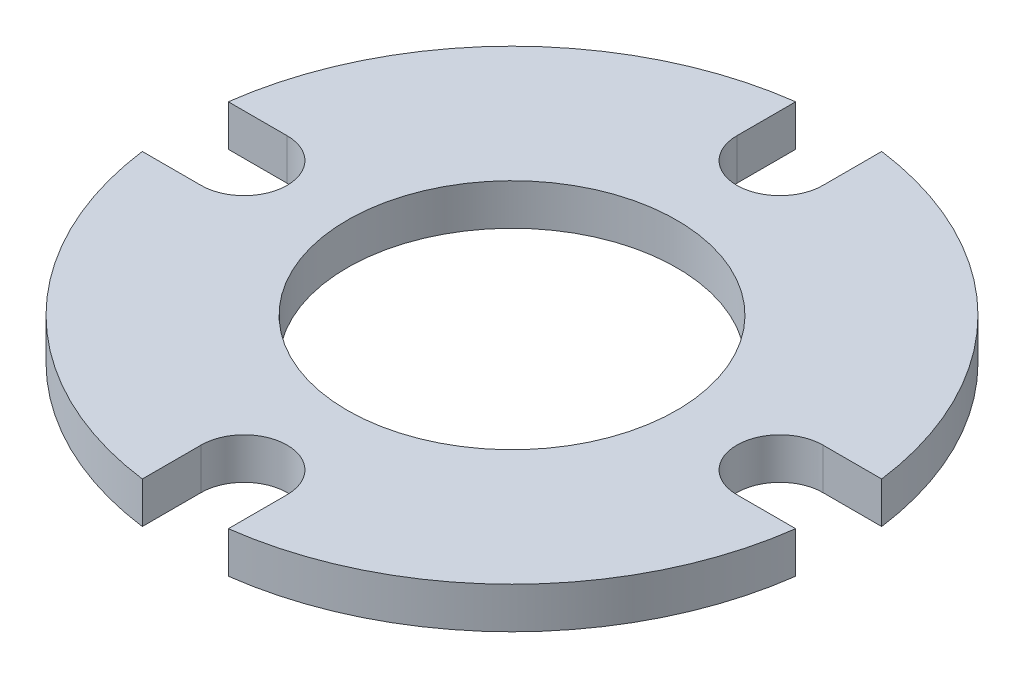
ISO-10303-21;
HEADER;
FILE_DESCRIPTION(('STEP AP214'),'2;1');
FILE_NAME('part.step','',(''),(''),'','','');
FILE_SCHEMA(('AUTOMOTIVE_DESIGN { 1 0 10303 214 1 1 1 1 }'));
ENDSEC;
DATA;
#1=APPLICATION_CONTEXT('core data for automotive mechanical design processes');
#2=APPLICATION_PROTOCOL_DEFINITION('international standard','automotive_design',2000,#1);
#3=PRODUCT_CONTEXT('',#1,'mechanical');
#4=PRODUCT('Part','Part','',(#3));
#5=PRODUCT_RELATED_PRODUCT_CATEGORY('part','',(#4));
#6=PRODUCT_DEFINITION_FORMATION('','',#4);
#7=PRODUCT_DEFINITION_CONTEXT('part definition',#1,'design');
#8=PRODUCT_DEFINITION('design','',#6,#7);
#9=PRODUCT_DEFINITION_SHAPE('','',#8);
#10=(LENGTH_UNIT() NAMED_UNIT(*) SI_UNIT(.MILLI.,.METRE.));
#11=(NAMED_UNIT(*) PLANE_ANGLE_UNIT() SI_UNIT($,.RADIAN.));
#12=(NAMED_UNIT(*) SI_UNIT($,.STERADIAN.) SOLID_ANGLE_UNIT());
#13=UNCERTAINTY_MEASURE_WITH_UNIT(LENGTH_MEASURE(1.E-05),#10,'distance_accuracy_value','');
#14=(GEOMETRIC_REPRESENTATION_CONTEXT(3) GLOBAL_UNCERTAINTY_ASSIGNED_CONTEXT((#13)) GLOBAL_UNIT_ASSIGNED_CONTEXT((#10,
#11,#12)) REPRESENTATION_CONTEXT('',''));
#15=CARTESIAN_POINT('',(0.,0.,0.));
#16=DIRECTION('',(0.,0.,1.));
#17=DIRECTION('',(1.,0.,0.));
#18=AXIS2_PLACEMENT_3D('',#15,#16,#17);
#19=CARTESIAN_POINT('',(0.,0.125,0.));
#20=DIRECTION('',(0.,1.,0.));
#21=DIRECTION('',(0.,0.,1.));
#22=AXIS2_PLACEMENT_3D('',#19,#20,#21);
#23=PLANE('',#22);
#24=CARTESIAN_POINT('',(0.,0.125,0.));
#25=DIRECTION('',(0.,1.,0.));
#26=DIRECTION('',(0.,0.,1.));
#27=AXIS2_PLACEMENT_3D('',#24,#25,#26);
#28=CIRCLE('',#27,0.5);
#29=CARTESIAN_POINT('',(0.,0.125,0.5));
#30=VERTEX_POINT('',#29);
#31=EDGE_CURVE('E314',#30,#30,#28,.T.);
#32=ORIENTED_EDGE('',*,*,#31,.F.);
#33=EDGE_LOOP('',(#32));
#34=FACE_BOUND('',#33,.T.);
#35=CARTESIAN_POINT('',(-0.813,0.125,0.));
#36=DIRECTION('',(0.,1.,0.));
#37=DIRECTION('',(1.,0.,0.));
#38=AXIS2_PLACEMENT_3D('',#35,#36,#37);
#39=CIRCLE('',#38,0.130555483320571);
#40=CARTESIAN_POINT('',(-0.813,0.125,-0.130555483320568));
#41=VERTEX_POINT('',#40);
#42=CARTESIAN_POINT('',(-0.813,0.125,0.130555483320574));
#43=VERTEX_POINT('',#42);
#44=EDGE_CURVE('E326',#41,#43,#39,.F.);
#45=ORIENTED_EDGE('',*,*,#44,.T.);
#46=DIRECTION('',(-1.,0.,0.));
#47=VECTOR('',#46,1.);
#48=CARTESIAN_POINT('',(0.,0.125,0.130555483320571));
#49=LINE('',#48,#47);
#50=CARTESIAN_POINT('',(-0.991441004687082,0.125,0.130555483320575));
#51=VERTEX_POINT('',#50);
#52=EDGE_CURVE('E335',#43,#51,#49,.T.);
#53=ORIENTED_EDGE('',*,*,#52,.T.);
#54=CARTESIAN_POINT('',(0.,0.125,0.));
#55=DIRECTION('',(0.,1.,0.));
#56=DIRECTION('',(0.,0.,1.));
#57=AXIS2_PLACEMENT_3D('',#54,#55,#56);
#58=CIRCLE('',#57,1.);
#59=CARTESIAN_POINT('',(-0.130555483320571,0.125,0.991441004687083));
#60=VERTEX_POINT('',#59);
#61=EDGE_CURVE('E211',#51,#60,#58,.T.);
#62=ORIENTED_EDGE('',*,*,#61,.T.);
#63=DIRECTION('',(0.,0.,-1.));
#64=VECTOR('',#63,1.);
#65=CARTESIAN_POINT('',(-0.130555483320571,0.125,0.));
#66=LINE('',#65,#64);
#67=CARTESIAN_POINT('',(-0.130555483320571,0.125,0.813));
#68=VERTEX_POINT('',#67);
#69=EDGE_CURVE('E63',#60,#68,#66,.T.);
#70=ORIENTED_EDGE('',*,*,#69,.T.);
#71=CARTESIAN_POINT('',(0.,0.125,0.813));
#72=DIRECTION('',(0.,1.,0.));
#73=DIRECTION('',(0.,0.,-1.));
#74=AXIS2_PLACEMENT_3D('',#71,#72,#73);
#75=CIRCLE('',#74,0.130555483320571);
#76=CARTESIAN_POINT('',(0.130555483320571,0.125,0.813));
#77=VERTEX_POINT('',#76);
#78=EDGE_CURVE('E356',#68,#77,#75,.F.);
#79=ORIENTED_EDGE('',*,*,#78,.T.);
#80=DIRECTION('',(0.,0.,1.));
#81=VECTOR('',#80,1.);
#82=CARTESIAN_POINT('',(0.130555483320571,0.125,0.));
#83=LINE('',#82,#81);
#84=CARTESIAN_POINT('',(0.130555483320571,0.125,0.991441004687083));
#85=VERTEX_POINT('',#84);
#86=EDGE_CURVE('E226',#77,#85,#83,.T.);
#87=ORIENTED_EDGE('',*,*,#86,.T.);
#88=CARTESIAN_POINT('',(0.991441004687084,0.125,0.130555483320561));
#89=VERTEX_POINT('',#88);
#90=EDGE_CURVE('E185',#85,#89,#58,.T.);
#91=ORIENTED_EDGE('',*,*,#90,.T.);
#92=DIRECTION('',(-1.,0.,0.));
#93=VECTOR('',#92,1.);
#94=CARTESIAN_POINT('',(0.,0.125,0.130555483320571));
#95=LINE('',#94,#93);
#96=CARTESIAN_POINT('',(0.813000000000001,0.125,0.130555483320563));
#97=VERTEX_POINT('',#96);
#98=EDGE_CURVE('E55',#89,#97,#95,.T.);
#99=ORIENTED_EDGE('',*,*,#98,.T.);
#100=CARTESIAN_POINT('',(0.813,0.125,0.));
#101=DIRECTION('',(0.,1.,0.));
#102=DIRECTION('',(-1.,0.,0.));
#103=AXIS2_PLACEMENT_3D('',#100,#101,#102);
#104=CIRCLE('',#103,0.130555483320571);
#105=CARTESIAN_POINT('',(0.812999999999999,0.125,-0.13055548332058));
#106=VERTEX_POINT('',#105);
#107=EDGE_CURVE('E248',#97,#106,#104,.F.);
#108=ORIENTED_EDGE('',*,*,#107,.T.);
#109=DIRECTION('',(1.,0.,0.));
#110=VECTOR('',#109,1.);
#111=CARTESIAN_POINT('',(0.,0.125,-0.130555483320571));
#112=LINE('',#111,#110);
#113=CARTESIAN_POINT('',(0.991441004687082,0.125,-0.130555483320582));
#114=VERTEX_POINT('',#113);
#115=EDGE_CURVE('E258',#106,#114,#112,.T.);
#116=ORIENTED_EDGE('',*,*,#115,.T.);
#117=CARTESIAN_POINT('',(0.130555483320571,0.125,-0.991441004687083));
#118=VERTEX_POINT('',#117);
#119=EDGE_CURVE('E179',#114,#118,#58,.T.);
#120=ORIENTED_EDGE('',*,*,#119,.T.);
#121=DIRECTION('',(0.,0.,1.));
#122=VECTOR('',#121,1.);
#123=CARTESIAN_POINT('',(0.130555483320571,0.125,0.));
#124=LINE('',#123,#122);
#125=CARTESIAN_POINT('',(0.130555483320571,0.125,-0.813));
#126=VERTEX_POINT('',#125);
#127=EDGE_CURVE('E206',#118,#126,#124,.T.);
#128=ORIENTED_EDGE('',*,*,#127,.T.);
#129=CARTESIAN_POINT('',(0.,0.125,-0.813));
#130=DIRECTION('',(0.,1.,0.));
#131=DIRECTION('',(0.,0.,1.));
#132=AXIS2_PLACEMENT_3D('',#129,#130,#131);
#133=CIRCLE('',#132,0.130555483320571);
#134=CARTESIAN_POINT('',(-0.130555483320571,0.125,-0.813));
#135=VERTEX_POINT('',#134);
#136=EDGE_CURVE('E201',#126,#135,#133,.F.);
#137=ORIENTED_EDGE('',*,*,#136,.T.);
#138=DIRECTION('',(0.,0.,-1.));
#139=VECTOR('',#138,1.);
#140=CARTESIAN_POINT('',(-0.130555483320571,0.125,0.));
#141=LINE('',#140,#139);
#142=CARTESIAN_POINT('',(-0.130555483320571,0.125,-0.991441004687083));
#143=VERTEX_POINT('',#142);
#144=EDGE_CURVE('E192',#135,#143,#141,.T.);
#145=ORIENTED_EDGE('',*,*,#144,.T.);
#146=CARTESIAN_POINT('',(-0.991441004687083,0.125,-0.130555483320568));
#147=VERTEX_POINT('',#146);
#148=EDGE_CURVE('E187',#143,#147,#58,.T.);
#149=ORIENTED_EDGE('',*,*,#148,.T.);
#150=DIRECTION('',(1.,0.,0.));
#151=VECTOR('',#150,1.);
#152=CARTESIAN_POINT('',(0.,0.125,-0.130555483320571));
#153=LINE('',#152,#151);
#154=EDGE_CURVE('E158',#147,#41,#153,.T.);
#155=ORIENTED_EDGE('',*,*,#154,.T.);
#156=EDGE_LOOP('',(#45,#53,#62,#70,#79,#87,#91,#99,#108,#116,#120,#128,#137,#145,#149,#155));
#157=FACE_BOUND('',#156,.T.);
#158=ADVANCED_FACE('F39',(#34,#157),#23,.T.);
#159=CARTESIAN_POINT('',(0.,0.,0.));
#160=DIRECTION('',(0.,1.,0.));
#161=DIRECTION('',(0.,0.,1.));
#162=AXIS2_PLACEMENT_3D('',#159,#160,#161);
#163=PLANE('',#162);
#164=CARTESIAN_POINT('',(0.,0.,0.));
#165=DIRECTION('',(0.,1.,0.));
#166=DIRECTION('',(0.,0.,1.));
#167=AXIS2_PLACEMENT_3D('',#164,#165,#166);
#168=CIRCLE('',#167,0.5);
#169=CARTESIAN_POINT('',(0.,0.,0.5));
#170=VERTEX_POINT('',#169);
#171=EDGE_CURVE('E241',#170,#170,#168,.T.);
#172=ORIENTED_EDGE('',*,*,#171,.T.);
#173=EDGE_LOOP('',(#172));
#174=FACE_BOUND('',#173,.T.);
#175=DIRECTION('',(-1.,0.,0.));
#176=VECTOR('',#175,1.);
#177=CARTESIAN_POINT('',(0.,0.,0.130555483320571));
#178=LINE('',#177,#176);
#179=CARTESIAN_POINT('',(-0.813,0.,0.130555483320574));
#180=VERTEX_POINT('',#179);
#181=CARTESIAN_POINT('',(-0.991441004687082,0.,0.130555483320575));
#182=VERTEX_POINT('',#181);
#183=EDGE_CURVE('E338',#180,#182,#178,.T.);
#184=ORIENTED_EDGE('',*,*,#183,.F.);
#185=CARTESIAN_POINT('',(-0.813,0.,0.));
#186=DIRECTION('',(0.,1.,0.));
#187=DIRECTION('',(1.,0.,0.));
#188=AXIS2_PLACEMENT_3D('',#185,#186,#187);
#189=CIRCLE('',#188,0.130555483320571);
#190=CARTESIAN_POINT('',(-0.813,0.,-0.130555483320568));
#191=VERTEX_POINT('',#190);
#192=EDGE_CURVE('E171',#191,#180,#189,.F.);
#193=ORIENTED_EDGE('',*,*,#192,.F.);
#194=DIRECTION('',(1.,0.,0.));
#195=VECTOR('',#194,1.);
#196=CARTESIAN_POINT('',(0.,0.,-0.130555483320571));
#197=LINE('',#196,#195);
#198=CARTESIAN_POINT('',(-0.991441004687083,0.,-0.130555483320568));
#199=VERTEX_POINT('',#198);
#200=EDGE_CURVE('E155',#199,#191,#197,.T.);
#201=ORIENTED_EDGE('',*,*,#200,.F.);
#202=CARTESIAN_POINT('',(0.,0.,0.));
#203=DIRECTION('',(0.,1.,0.));
#204=DIRECTION('',(0.,0.,1.));
#205=AXIS2_PLACEMENT_3D('',#202,#203,#204);
#206=CIRCLE('',#205,1.);
#207=CARTESIAN_POINT('',(-0.130555483320571,0.,-0.991441004687083));
#208=VERTEX_POINT('',#207);
#209=EDGE_CURVE('E170',#208,#199,#206,.T.);
#210=ORIENTED_EDGE('',*,*,#209,.F.);
#211=DIRECTION('',(0.,0.,-1.));
#212=VECTOR('',#211,1.);
#213=CARTESIAN_POINT('',(-0.130555483320571,0.,0.));
#214=LINE('',#213,#212);
#215=CARTESIAN_POINT('',(-0.130555483320571,0.,-0.813));
#216=VERTEX_POINT('',#215);
#217=EDGE_CURVE('E11',#216,#208,#214,.T.);
#218=ORIENTED_EDGE('',*,*,#217,.F.);
#219=CARTESIAN_POINT('',(0.,0.,-0.813));
#220=DIRECTION('',(0.,1.,0.));
#221=DIRECTION('',(0.,0.,1.));
#222=AXIS2_PLACEMENT_3D('',#219,#220,#221);
#223=CIRCLE('',#222,0.130555483320571);
#224=CARTESIAN_POINT('',(0.130555483320571,0.,-0.813));
#225=VERTEX_POINT('',#224);
#226=EDGE_CURVE('E48',#225,#216,#223,.F.);
#227=ORIENTED_EDGE('',*,*,#226,.F.);
#228=DIRECTION('',(0.,0.,1.));
#229=VECTOR('',#228,1.);
#230=CARTESIAN_POINT('',(0.130555483320571,0.,0.));
#231=LINE('',#230,#229);
#232=CARTESIAN_POINT('',(0.130555483320571,0.,-0.991441004687083));
#233=VERTEX_POINT('',#232);
#234=EDGE_CURVE('E210',#233,#225,#231,.T.);
#235=ORIENTED_EDGE('',*,*,#234,.F.);
#236=CARTESIAN_POINT('',(0.991441004687082,0.,-0.130555483320582));
#237=VERTEX_POINT('',#236);
#238=EDGE_CURVE('E182',#237,#233,#206,.T.);
#239=ORIENTED_EDGE('',*,*,#238,.F.);
#240=DIRECTION('',(1.,0.,0.));
#241=VECTOR('',#240,1.);
#242=CARTESIAN_POINT('',(0.,0.,-0.130555483320571));
#243=LINE('',#242,#241);
#244=CARTESIAN_POINT('',(0.812999999999999,0.,-0.13055548332058));
#245=VERTEX_POINT('',#244);
#246=EDGE_CURVE('E262',#245,#237,#243,.T.);
#247=ORIENTED_EDGE('',*,*,#246,.F.);
#248=CARTESIAN_POINT('',(0.813,0.,0.));
#249=DIRECTION('',(0.,1.,0.));
#250=DIRECTION('',(-1.,0.,0.));
#251=AXIS2_PLACEMENT_3D('',#248,#249,#250);
#252=CIRCLE('',#251,0.130555483320571);
#253=CARTESIAN_POINT('',(0.813000000000001,0.,0.130555483320563));
#254=VERTEX_POINT('',#253);
#255=EDGE_CURVE('E251',#254,#245,#252,.F.);
#256=ORIENTED_EDGE('',*,*,#255,.F.);
#257=DIRECTION('',(-1.,0.,0.));
#258=VECTOR('',#257,1.);
#259=CARTESIAN_POINT('',(0.,0.,0.130555483320571));
#260=LINE('',#259,#258);
#261=CARTESIAN_POINT('',(0.991441004687084,0.,0.130555483320561));
#262=VERTEX_POINT('',#261);
#263=EDGE_CURVE('E235',#262,#254,#260,.T.);
#264=ORIENTED_EDGE('',*,*,#263,.F.);
#265=CARTESIAN_POINT('',(0.130555483320571,0.,0.991441004687083));
#266=VERTEX_POINT('',#265);
#267=EDGE_CURVE('E189',#266,#262,#206,.T.);
#268=ORIENTED_EDGE('',*,*,#267,.F.);
#269=DIRECTION('',(0.,0.,1.));
#270=VECTOR('',#269,1.);
#271=CARTESIAN_POINT('',(0.130555483320571,0.,0.));
#272=LINE('',#271,#270);
#273=CARTESIAN_POINT('',(0.130555483320571,0.,0.813));
#274=VERTEX_POINT('',#273);
#275=EDGE_CURVE('E368',#274,#266,#272,.T.);
#276=ORIENTED_EDGE('',*,*,#275,.F.);
#277=CARTESIAN_POINT('',(0.,0.,0.813));
#278=DIRECTION('',(0.,1.,0.));
#279=DIRECTION('',(0.,0.,-1.));
#280=AXIS2_PLACEMENT_3D('',#277,#278,#279);
#281=CIRCLE('',#280,0.130555483320571);
#282=CARTESIAN_POINT('',(-0.130555483320571,0.,0.813));
#283=VERTEX_POINT('',#282);
#284=EDGE_CURVE('E359',#283,#274,#281,.F.);
#285=ORIENTED_EDGE('',*,*,#284,.F.);
#286=DIRECTION('',(0.,0.,-1.));
#287=VECTOR('',#286,1.);
#288=CARTESIAN_POINT('',(-0.130555483320571,0.,0.));
#289=LINE('',#288,#287);
#290=CARTESIAN_POINT('',(-0.130555483320571,0.,0.991441004687083));
#291=VERTEX_POINT('',#290);
#292=EDGE_CURVE('E349',#291,#283,#289,.T.);
#293=ORIENTED_EDGE('',*,*,#292,.F.);
#294=EDGE_CURVE('E180',#182,#291,#206,.T.);
#295=ORIENTED_EDGE('',*,*,#294,.F.);
#296=EDGE_LOOP('',(#184,#193,#201,#210,#218,#227,#235,#239,#247,#256,#264,#268,#276,#285,#293,#295));
#297=FACE_BOUND('',#296,.T.);
#298=ADVANCED_FACE('F169',(#174,#297),#163,.F.);
#299=CARTESIAN_POINT('',(0.,0.125,0.));
#300=DIRECTION('',(0.,-1.,0.));
#301=DIRECTION('',(0.,0.,-1.));
#302=AXIS2_PLACEMENT_3D('',#299,#300,#301);
#303=CYLINDRICAL_SURFACE('',#302,1.);
#304=DIRECTION('',(0.,-1.,0.));
#305=VECTOR('',#304,1.);
#306=CARTESIAN_POINT('',(-0.991441004687082,3.66398489153316,0.130555483320575));
#307=LINE('',#306,#305);
#308=EDGE_CURVE('E277',#51,#182,#307,.T.);
#309=ORIENTED_EDGE('',*,*,#308,.T.);
#310=ORIENTED_EDGE('',*,*,#294,.T.);
#311=DIRECTION('',(0.,-1.,0.));
#312=VECTOR('',#311,1.);
#313=CARTESIAN_POINT('',(-0.130555483320571,3.66398489153316,0.991441004687083));
#314=LINE('',#313,#312);
#315=EDGE_CURVE('E346',#60,#291,#314,.T.);
#316=ORIENTED_EDGE('',*,*,#315,.F.);
#317=ORIENTED_EDGE('',*,*,#61,.F.);
#318=EDGE_LOOP('',(#309,#310,#316,#317));
#319=FACE_BOUND('',#318,.T.);
#320=ADVANCED_FACE('F41',(#319),#303,.T.);
#321=DIRECTION('',(0.,-1.,0.));
#322=VECTOR('',#321,1.);
#323=CARTESIAN_POINT('',(-0.991441004687083,3.66398489153316,-0.130555483320568));
#324=LINE('',#323,#322);
#325=EDGE_CURVE('E152',#147,#199,#324,.T.);
#326=ORIENTED_EDGE('',*,*,#325,.F.);
#327=ORIENTED_EDGE('',*,*,#148,.F.);
#328=DIRECTION('',(0.,-1.,0.));
#329=VECTOR('',#328,1.);
#330=CARTESIAN_POINT('',(-0.130555483320571,3.66398489153316,-0.991441004687083));
#331=LINE('',#330,#329);
#332=EDGE_CURVE('E177',#143,#208,#331,.T.);
#333=ORIENTED_EDGE('',*,*,#332,.T.);
#334=ORIENTED_EDGE('',*,*,#209,.T.);
#335=EDGE_LOOP('',(#326,#327,#333,#334));
#336=FACE_BOUND('',#335,.T.);
#337=ADVANCED_FACE('F175',(#336),#303,.T.);
#338=DIRECTION('',(0.,-1.,0.));
#339=VECTOR('',#338,1.);
#340=CARTESIAN_POINT('',(0.130555483320571,3.66398489153316,0.991441004687083));
#341=LINE('',#340,#339);
#342=EDGE_CURVE('E230',#85,#266,#341,.T.);
#343=ORIENTED_EDGE('',*,*,#342,.T.);
#344=ORIENTED_EDGE('',*,*,#267,.T.);
#345=DIRECTION('',(0.,-1.,0.));
#346=VECTOR('',#345,1.);
#347=CARTESIAN_POINT('',(0.991441004687084,3.66398489153316,0.130555483320561));
#348=LINE('',#347,#346);
#349=EDGE_CURVE('E232',#89,#262,#348,.T.);
#350=ORIENTED_EDGE('',*,*,#349,.F.);
#351=ORIENTED_EDGE('',*,*,#90,.F.);
#352=EDGE_LOOP('',(#343,#344,#350,#351));
#353=FACE_BOUND('',#352,.T.);
#354=ADVANCED_FACE('F229',(#353),#303,.T.);
#355=DIRECTION('',(0.,-1.,0.));
#356=VECTOR('',#355,1.);
#357=CARTESIAN_POINT('',(0.991441004687082,3.66398489153316,-0.130555483320582));
#358=LINE('',#357,#356);
#359=EDGE_CURVE('E265',#114,#237,#358,.T.);
#360=ORIENTED_EDGE('',*,*,#359,.T.);
#361=ORIENTED_EDGE('',*,*,#238,.T.);
#362=DIRECTION('',(0.,-1.,0.));
#363=VECTOR('',#362,1.);
#364=CARTESIAN_POINT('',(0.130555483320571,3.66398489153316,-0.991441004687083));
#365=LINE('',#364,#363);
#366=EDGE_CURVE('E268',#118,#233,#365,.T.);
#367=ORIENTED_EDGE('',*,*,#366,.F.);
#368=ORIENTED_EDGE('',*,*,#119,.F.);
#369=EDGE_LOOP('',(#360,#361,#367,#368));
#370=FACE_BOUND('',#369,.T.);
#371=ADVANCED_FACE('F298',(#370),#303,.T.);
#372=CARTESIAN_POINT('',(-0.130555483320571,3.66398489153316,-0.991441004687083));
#373=DIRECTION('',(1.,0.,0.));
#374=DIRECTION('',(0.,0.,-1.));
#375=AXIS2_PLACEMENT_3D('',#372,#373,#374);
#376=PLANE('',#375);
#377=ORIENTED_EDGE('',*,*,#144,.F.);
#378=DIRECTION('',(0.,-1.,0.));
#379=VECTOR('',#378,1.);
#380=CARTESIAN_POINT('',(-0.130555483320571,3.66398489153316,-0.813));
#381=LINE('',#380,#379);
#382=EDGE_CURVE('E272',#135,#216,#381,.T.);
#383=ORIENTED_EDGE('',*,*,#382,.T.);
#384=ORIENTED_EDGE('',*,*,#217,.T.);
#385=ORIENTED_EDGE('',*,*,#332,.F.);
#386=EDGE_LOOP('',(#377,#383,#384,#385));
#387=FACE_BOUND('',#386,.T.);
#388=ADVANCED_FACE('F296',(#387),#376,.T.);
#389=CARTESIAN_POINT('',(0.,3.66398489153316,-0.813));
#390=DIRECTION('',(0.,-1.,0.));
#391=DIRECTION('',(0.,0.,-1.));
#392=AXIS2_PLACEMENT_3D('',#389,#390,#391);
#393=CYLINDRICAL_SURFACE('',#392,0.130555483320571);
#394=ORIENTED_EDGE('',*,*,#136,.F.);
#395=DIRECTION('',(0.,-1.,0.));
#396=VECTOR('',#395,1.);
#397=CARTESIAN_POINT('',(0.130555483320571,3.66398489153316,-0.813));
#398=LINE('',#397,#396);
#399=EDGE_CURVE('E273',#126,#225,#398,.T.);
#400=ORIENTED_EDGE('',*,*,#399,.T.);
#401=ORIENTED_EDGE('',*,*,#226,.T.);
#402=ORIENTED_EDGE('',*,*,#382,.F.);
#403=EDGE_LOOP('',(#394,#400,#401,#402));
#404=FACE_BOUND('',#403,.T.);
#405=ADVANCED_FACE('F290',(#404),#393,.F.);
#406=CARTESIAN_POINT('',(0.130555483320571,3.66398489153316,-0.813));
#407=DIRECTION('',(-1.,0.,0.));
#408=DIRECTION('',(0.,0.,1.));
#409=AXIS2_PLACEMENT_3D('',#406,#407,#408);
#410=PLANE('',#409);
#411=ORIENTED_EDGE('',*,*,#127,.F.);
#412=ORIENTED_EDGE('',*,*,#366,.T.);
#413=ORIENTED_EDGE('',*,*,#234,.T.);
#414=ORIENTED_EDGE('',*,*,#399,.F.);
#415=EDGE_LOOP('',(#411,#412,#413,#414));
#416=FACE_BOUND('',#415,.T.);
#417=ADVANCED_FACE('F292',(#416),#410,.T.);
#418=CARTESIAN_POINT('',(0.991441004687082,3.66398489153316,-0.130555483320582));
#419=DIRECTION('',(0.,0.,1.));
#420=DIRECTION('',(1.,0.,0.));
#421=AXIS2_PLACEMENT_3D('',#418,#419,#420);
#422=PLANE('',#421);
#423=ORIENTED_EDGE('',*,*,#115,.F.);
#424=DIRECTION('',(0.,-1.,0.));
#425=VECTOR('',#424,1.);
#426=CARTESIAN_POINT('',(0.812999999999999,3.66398489153316,-0.13055548332058));
#427=LINE('',#426,#425);
#428=EDGE_CURVE('E254',#106,#245,#427,.T.);
#429=ORIENTED_EDGE('',*,*,#428,.T.);
#430=ORIENTED_EDGE('',*,*,#246,.T.);
#431=ORIENTED_EDGE('',*,*,#359,.F.);
#432=EDGE_LOOP('',(#423,#429,#430,#431));
#433=FACE_BOUND('',#432,.T.);
#434=ADVANCED_FACE('F383',(#433),#422,.T.);
#435=CARTESIAN_POINT('',(0.813,3.66398489153316,0.));
#436=DIRECTION('',(0.,-1.,0.));
#437=DIRECTION('',(1.,0.,0.));
#438=AXIS2_PLACEMENT_3D('',#435,#436,#437);
#439=CYLINDRICAL_SURFACE('',#438,0.130555483320571);
#440=ORIENTED_EDGE('',*,*,#107,.F.);
#441=DIRECTION('',(0.,-1.,0.));
#442=VECTOR('',#441,1.);
#443=CARTESIAN_POINT('',(0.813000000000001,3.66398489153316,0.130555483320563));
#444=LINE('',#443,#442);
#445=EDGE_CURVE('E239',#97,#254,#444,.T.);
#446=ORIENTED_EDGE('',*,*,#445,.T.);
#447=ORIENTED_EDGE('',*,*,#255,.T.);
#448=ORIENTED_EDGE('',*,*,#428,.F.);
#449=EDGE_LOOP('',(#440,#446,#447,#448));
#450=FACE_BOUND('',#449,.T.);
#451=ADVANCED_FACE('F380',(#450),#439,.F.);
#452=CARTESIAN_POINT('',(0.813000000000001,3.66398489153316,0.130555483320563));
#453=DIRECTION('',(0.,0.,-1.));
#454=DIRECTION('',(-1.,0.,0.));
#455=AXIS2_PLACEMENT_3D('',#452,#453,#454);
#456=PLANE('',#455);
#457=ORIENTED_EDGE('',*,*,#98,.F.);
#458=ORIENTED_EDGE('',*,*,#349,.T.);
#459=ORIENTED_EDGE('',*,*,#263,.T.);
#460=ORIENTED_EDGE('',*,*,#445,.F.);
#461=EDGE_LOOP('',(#457,#458,#459,#460));
#462=FACE_BOUND('',#461,.T.);
#463=ADVANCED_FACE('F377',(#462),#456,.T.);
#464=CARTESIAN_POINT('',(0.130555483320571,3.66398489153316,0.991441004687083));
#465=DIRECTION('',(-1.,0.,0.));
#466=DIRECTION('',(0.,0.,1.));
#467=AXIS2_PLACEMENT_3D('',#464,#465,#466);
#468=PLANE('',#467);
#469=ORIENTED_EDGE('',*,*,#86,.F.);
#470=DIRECTION('',(0.,-1.,0.));
#471=VECTOR('',#470,1.);
#472=CARTESIAN_POINT('',(0.130555483320571,3.66398489153316,0.813));
#473=LINE('',#472,#471);
#474=EDGE_CURVE('E362',#77,#274,#473,.T.);
#475=ORIENTED_EDGE('',*,*,#474,.T.);
#476=ORIENTED_EDGE('',*,*,#275,.T.);
#477=ORIENTED_EDGE('',*,*,#342,.F.);
#478=EDGE_LOOP('',(#469,#475,#476,#477));
#479=FACE_BOUND('',#478,.T.);
#480=ADVANCED_FACE('F373',(#479),#468,.T.);
#481=CARTESIAN_POINT('',(0.,3.66398489153316,0.813));
#482=DIRECTION('',(0.,-1.,0.));
#483=DIRECTION('',(0.,0.,1.));
#484=AXIS2_PLACEMENT_3D('',#481,#482,#483);
#485=CYLINDRICAL_SURFACE('',#484,0.130555483320571);
#486=ORIENTED_EDGE('',*,*,#78,.F.);
#487=DIRECTION('',(0.,-1.,0.));
#488=VECTOR('',#487,1.);
#489=CARTESIAN_POINT('',(-0.130555483320571,3.66398489153316,0.813));
#490=LINE('',#489,#488);
#491=EDGE_CURVE('E352',#68,#283,#490,.T.);
#492=ORIENTED_EDGE('',*,*,#491,.T.);
#493=ORIENTED_EDGE('',*,*,#284,.T.);
#494=ORIENTED_EDGE('',*,*,#474,.F.);
#495=EDGE_LOOP('',(#486,#492,#493,#494));
#496=FACE_BOUND('',#495,.T.);
#497=ADVANCED_FACE('F397',(#496),#485,.F.);
#498=CARTESIAN_POINT('',(-0.130555483320571,3.66398489153316,0.813));
#499=DIRECTION('',(1.,0.,0.));
#500=DIRECTION('',(0.,0.,-1.));
#501=AXIS2_PLACEMENT_3D('',#498,#499,#500);
#502=PLANE('',#501);
#503=ORIENTED_EDGE('',*,*,#69,.F.);
#504=ORIENTED_EDGE('',*,*,#315,.T.);
#505=ORIENTED_EDGE('',*,*,#292,.T.);
#506=ORIENTED_EDGE('',*,*,#491,.F.);
#507=EDGE_LOOP('',(#503,#504,#505,#506));
#508=FACE_BOUND('',#507,.T.);
#509=ADVANCED_FACE('F400',(#508),#502,.T.);
#510=CARTESIAN_POINT('',(-0.991441004687082,3.66398489153316,0.130555483320575));
#511=DIRECTION('',(0.,0.,-1.));
#512=DIRECTION('',(-1.,0.,0.));
#513=AXIS2_PLACEMENT_3D('',#510,#511,#512);
#514=PLANE('',#513);
#515=ORIENTED_EDGE('',*,*,#52,.F.);
#516=DIRECTION('',(0.,-1.,0.));
#517=VECTOR('',#516,1.);
#518=CARTESIAN_POINT('',(-0.813,3.66398489153316,0.130555483320574));
#519=LINE('',#518,#517);
#520=EDGE_CURVE('E331',#43,#180,#519,.T.);
#521=ORIENTED_EDGE('',*,*,#520,.T.);
#522=ORIENTED_EDGE('',*,*,#183,.T.);
#523=ORIENTED_EDGE('',*,*,#308,.F.);
#524=EDGE_LOOP('',(#515,#521,#522,#523));
#525=FACE_BOUND('',#524,.T.);
#526=ADVANCED_FACE('F404',(#525),#514,.T.);
#527=CARTESIAN_POINT('',(-0.813,3.66398489153316,0.));
#528=DIRECTION('',(0.,-1.,0.));
#529=DIRECTION('',(-1.,0.,0.));
#530=AXIS2_PLACEMENT_3D('',#527,#528,#529);
#531=CYLINDRICAL_SURFACE('',#530,0.130555483320571);
#532=ORIENTED_EDGE('',*,*,#44,.F.);
#533=DIRECTION('',(0.,-1.,0.));
#534=VECTOR('',#533,1.);
#535=CARTESIAN_POINT('',(-0.813,3.66398489153316,-0.130555483320568));
#536=LINE('',#535,#534);
#537=EDGE_CURVE('E173',#41,#191,#536,.T.);
#538=ORIENTED_EDGE('',*,*,#537,.T.);
#539=ORIENTED_EDGE('',*,*,#192,.T.);
#540=ORIENTED_EDGE('',*,*,#520,.F.);
#541=EDGE_LOOP('',(#532,#538,#539,#540));
#542=FACE_BOUND('',#541,.T.);
#543=ADVANCED_FACE('F407',(#542),#531,.F.);
#544=CARTESIAN_POINT('',(-0.813,3.66398489153316,-0.130555483320568));
#545=DIRECTION('',(0.,0.,1.));
#546=DIRECTION('',(1.,0.,0.));
#547=AXIS2_PLACEMENT_3D('',#544,#545,#546);
#548=PLANE('',#547);
#549=ORIENTED_EDGE('',*,*,#154,.F.);
#550=ORIENTED_EDGE('',*,*,#325,.T.);
#551=ORIENTED_EDGE('',*,*,#200,.T.);
#552=ORIENTED_EDGE('',*,*,#537,.F.);
#553=EDGE_LOOP('',(#549,#550,#551,#552));
#554=FACE_BOUND('',#553,.T.);
#555=ADVANCED_FACE('F154',(#554),#548,.T.);
#556=CARTESIAN_POINT('',(0.,0.,0.));
#557=DIRECTION('',(0.,1.,0.));
#558=DIRECTION('',(0.,0.,1.));
#559=AXIS2_PLACEMENT_3D('',#556,#557,#558);
#560=CYLINDRICAL_SURFACE('',#559,0.5);
#561=ORIENTED_EDGE('',*,*,#171,.F.);
#562=EDGE_LOOP('',(#561));
#563=FACE_BOUND('',#562,.T.);
#564=ORIENTED_EDGE('',*,*,#31,.T.);
#565=EDGE_LOOP('',(#564));
#566=FACE_BOUND('',#565,.T.);
#567=ADVANCED_FACE('F414',(#563,#566),#560,.F.);
#568=CLOSED_SHELL('',(#158,#298,#320,#337,#354,#371,#388,#405,#417,#434,#451,#463,#480,#497,
#509,#526,#543,#555,#567));
#569=MANIFOLD_SOLID_BREP('B2',#568);
#570=ADVANCED_BREP_SHAPE_REPRESENTATION('',(#18,#569),#14);
#571=SHAPE_DEFINITION_REPRESENTATION(#9,#570);
ENDSEC;
END-ISO-10303-21;
